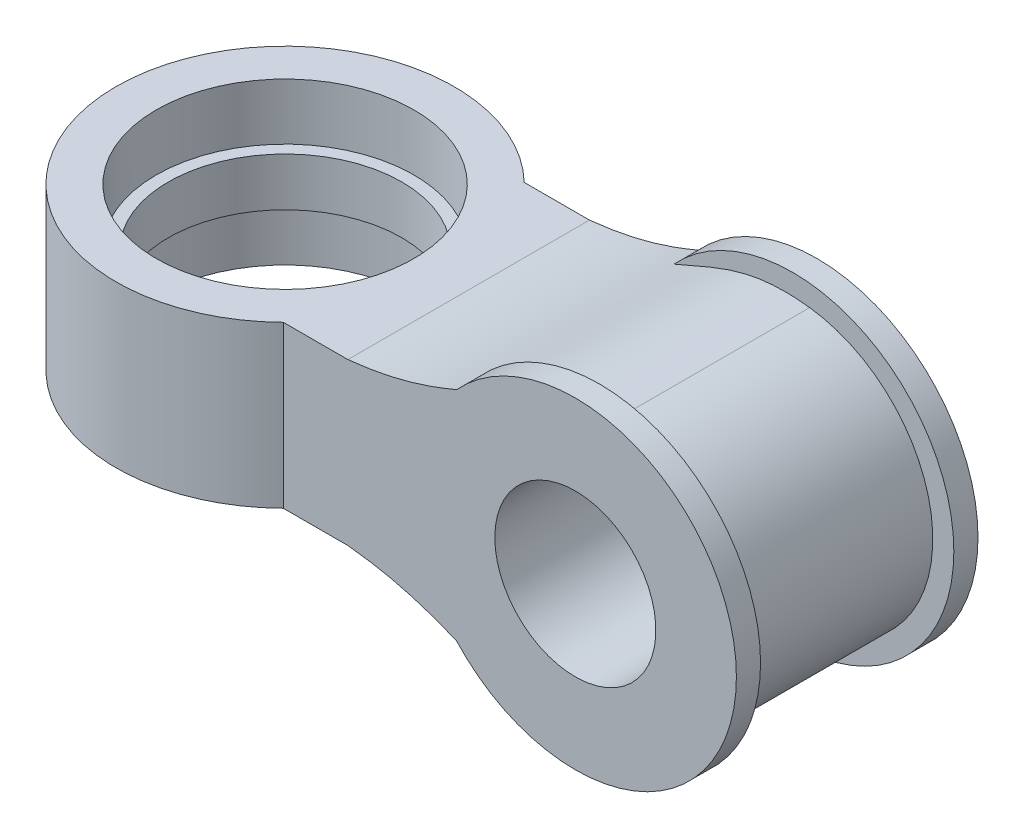
ISO-10303-21;
HEADER;
FILE_DESCRIPTION(('STEP AP214'),'2;1');
FILE_NAME('part.step','',(''),(''),'','','');
FILE_SCHEMA(('AUTOMOTIVE_DESIGN { 1 0 10303 214 1 1 1 1 }'));
ENDSEC;
DATA;
#1=APPLICATION_CONTEXT('core data for automotive mechanical design processes');
#2=APPLICATION_PROTOCOL_DEFINITION('international standard','automotive_design',2000,#1);
#3=PRODUCT_CONTEXT('',#1,'mechanical');
#4=PRODUCT('Part','Part','',(#3));
#5=PRODUCT_RELATED_PRODUCT_CATEGORY('part','',(#4));
#6=PRODUCT_DEFINITION_FORMATION('','',#4);
#7=PRODUCT_DEFINITION_CONTEXT('part definition',#1,'design');
#8=PRODUCT_DEFINITION('design','',#6,#7);
#9=PRODUCT_DEFINITION_SHAPE('','',#8);
#10=(LENGTH_UNIT() NAMED_UNIT(*) SI_UNIT(.MILLI.,.METRE.));
#11=(NAMED_UNIT(*) PLANE_ANGLE_UNIT() SI_UNIT($,.RADIAN.));
#12=(NAMED_UNIT(*) SI_UNIT($,.STERADIAN.) SOLID_ANGLE_UNIT());
#13=UNCERTAINTY_MEASURE_WITH_UNIT(LENGTH_MEASURE(1.E-05),#10,'distance_accuracy_value','');
#14=(GEOMETRIC_REPRESENTATION_CONTEXT(3) GLOBAL_UNCERTAINTY_ASSIGNED_CONTEXT((#13)) GLOBAL_UNIT_ASSIGNED_CONTEXT((#10,
#11,#12)) REPRESENTATION_CONTEXT('',''));
#15=CARTESIAN_POINT('',(0.,0.,0.));
#16=DIRECTION('',(0.,0.,1.));
#17=DIRECTION('',(1.,0.,0.));
#18=AXIS2_PLACEMENT_3D('',#15,#16,#17);
#19=CARTESIAN_POINT('',(-51.,-10.,15.0438784044279));
#20=DIRECTION('',(0.,1.,0.));
#21=DIRECTION('',(-1.,0.,0.));
#22=AXIS2_PLACEMENT_3D('',#19,#20,#21);
#23=CYLINDRICAL_SURFACE('',#22,16.);
#24=CARTESIAN_POINT('',(-51.,-10.,15.0438784044279));
#25=DIRECTION('',(0.,1.,0.));
#26=DIRECTION('',(-1.,0.,0.));
#27=AXIS2_PLACEMENT_3D('',#24,#25,#26);
#28=CIRCLE('',#27,16.);
#29=CARTESIAN_POINT('',(-67.,-10.,15.0438784044279));
#30=VERTEX_POINT('',#29);
#31=EDGE_CURVE('E227',#30,#30,#28,.T.);
#32=ORIENTED_EDGE('',*,*,#31,.F.);
#33=EDGE_LOOP('',(#32));
#34=FACE_BOUND('',#33,.T.);
#35=CARTESIAN_POINT('',(-51.,-3.,15.0438784044279));
#36=DIRECTION('',(0.,1.,0.));
#37=DIRECTION('',(0.,0.,1.));
#38=AXIS2_PLACEMENT_3D('',#35,#36,#37);
#39=CIRCLE('',#38,16.);
#40=CARTESIAN_POINT('',(-51.,-3.,31.0438784044279));
#41=VERTEX_POINT('',#40);
#42=EDGE_CURVE('E11',#41,#41,#39,.F.);
#43=ORIENTED_EDGE('',*,*,#42,.F.);
#44=EDGE_LOOP('',(#43));
#45=FACE_BOUND('',#44,.T.);
#46=ADVANCED_FACE('F41',(#34,#45),#23,.F.);
#47=CARTESIAN_POINT('',(0.,0.,30.));
#48=DIRECTION('',(0.,0.,-1.));
#49=DIRECTION('',(-1.,0.,0.));
#50=AXIS2_PLACEMENT_3D('',#47,#48,#49);
#51=CYLINDRICAL_SURFACE('',#50,17.3861277599397);
#52=DIRECTION('',(0.,0.,-1.));
#53=VECTOR('',#52,1.);
#54=CARTESIAN_POINT('',(2.10062296443295,17.2587607216231,30.));
#55=LINE('',#54,#53);
#56=CARTESIAN_POINT('',(2.10062296443295,17.2587607216231,27.));
#57=VERTEX_POINT('',#56);
#58=CARTESIAN_POINT('',(2.10062296443295,17.2587607216231,3.));
#59=VERTEX_POINT('',#58);
#60=EDGE_CURVE('E300',#57,#59,#55,.T.);
#61=ORIENTED_EDGE('',*,*,#60,.F.);
#62=CARTESIAN_POINT('',(0.,0.,27.));
#63=DIRECTION('',(0.,0.,1.));
#64=DIRECTION('',(1.,0.,0.));
#65=AXIS2_PLACEMENT_3D('',#62,#63,#64);
#66=CIRCLE('',#65,17.3861277599397);
#67=CARTESIAN_POINT('',(2.10062296443295,-17.2587607216231,27.));
#68=VERTEX_POINT('',#67);
#69=EDGE_CURVE('E336',#57,#68,#66,.F.);
#70=ORIENTED_EDGE('',*,*,#69,.T.);
#71=DIRECTION('',(0.,0.,-1.));
#72=VECTOR('',#71,1.);
#73=CARTESIAN_POINT('',(2.10062296443295,-17.2587607216231,30.));
#74=LINE('',#73,#72);
#75=CARTESIAN_POINT('',(2.10062296443295,-17.2587607216231,3.));
#76=VERTEX_POINT('',#75);
#77=EDGE_CURVE('E293',#68,#76,#74,.T.);
#78=ORIENTED_EDGE('',*,*,#77,.T.);
#79=CARTESIAN_POINT('',(0.,0.,3.));
#80=DIRECTION('',(0.,0.,1.));
#81=DIRECTION('',(1.,0.,0.));
#82=AXIS2_PLACEMENT_3D('',#79,#80,#81);
#83=CIRCLE('',#82,17.3861277599397);
#84=EDGE_CURVE('E317',#76,#59,#83,.T.);
#85=ORIENTED_EDGE('',*,*,#84,.T.);
#86=EDGE_LOOP('',(#61,#70,#78,#85));
#87=FACE_BOUND('',#86,.T.);
#88=ADVANCED_FACE('F174',(#87),#51,.T.);
#89=CARTESIAN_POINT('',(0.,0.,3.));
#90=DIRECTION('',(0.,0.,-1.));
#91=DIRECTION('',(-1.,0.,0.));
#92=AXIS2_PLACEMENT_3D('',#89,#90,#91);
#93=CYLINDRICAL_SURFACE('',#92,20.);
#94=DIRECTION('',(0.,0.,-1.));
#95=VECTOR('',#94,1.);
#96=CARTESIAN_POINT('',(-14.7412270743129,-13.5165167237548,30.));
#97=LINE('',#96,#95);
#98=CARTESIAN_POINT('',(-14.7412270743129,-13.5165167237548,0.));
#99=VERTEX_POINT('',#98);
#100=CARTESIAN_POINT('',(-14.7412270743129,-13.5165167237548,3.));
#101=VERTEX_POINT('',#100);
#102=EDGE_CURVE('E326',#99,#101,#97,.F.);
#103=ORIENTED_EDGE('',*,*,#102,.F.);
#104=CARTESIAN_POINT('',(0.,0.,0.));
#105=DIRECTION('',(0.,0.,1.));
#106=DIRECTION('',(1.,0.,0.));
#107=AXIS2_PLACEMENT_3D('',#104,#105,#106);
#108=CIRCLE('',#107,20.);
#109=CARTESIAN_POINT('',(-14.7412270743129,13.5165167237548,0.));
#110=VERTEX_POINT('',#109);
#111=EDGE_CURVE('E332',#99,#110,#108,.T.);
#112=ORIENTED_EDGE('',*,*,#111,.T.);
#113=DIRECTION('',(0.,0.,-1.));
#114=VECTOR('',#113,1.);
#115=CARTESIAN_POINT('',(-14.7412270743129,13.5165167237548,30.));
#116=LINE('',#115,#114);
#117=CARTESIAN_POINT('',(-14.7412270743129,13.5165167237548,3.));
#118=VERTEX_POINT('',#117);
#119=EDGE_CURVE('E310',#110,#118,#116,.F.);
#120=ORIENTED_EDGE('',*,*,#119,.T.);
#121=CARTESIAN_POINT('',(0.,0.,3.));
#122=DIRECTION('',(0.,0.,1.));
#123=DIRECTION('',(1.,0.,0.));
#124=AXIS2_PLACEMENT_3D('',#121,#122,#123);
#125=CIRCLE('',#124,20.);
#126=EDGE_CURVE('E333',#101,#118,#125,.T.);
#127=ORIENTED_EDGE('',*,*,#126,.F.);
#128=EDGE_LOOP('',(#103,#112,#120,#127));
#129=FACE_BOUND('',#128,.T.);
#130=ADVANCED_FACE('F43',(#129),#93,.T.);
#131=CARTESIAN_POINT('',(0.,0.,3.));
#132=DIRECTION('',(0.,0.,1.));
#133=DIRECTION('',(1.,0.,0.));
#134=AXIS2_PLACEMENT_3D('',#131,#132,#133);
#135=PLANE('',#134);
#136=ORIENTED_EDGE('',*,*,#84,.F.);
#137=CARTESIAN_POINT('',(-28.2444508318275,-10.,3.));
#138=CARTESIAN_POINT('',(-12.9902671690807,-11.5555353558737,3.));
#139=CARTESIAN_POINT('',(-9.90093372395772,-18.7195113511275,3.));
#140=CARTESIAN_POINT('',(2.10062296443295,-17.2587607216231,3.));
#141=B_SPLINE_CURVE_WITH_KNOTS('',3,(#137,#138,#139,#140),.UNSPECIFIED.,.F.,.F.,(4,4),(0.,1.),.UNSPECIFIED.);
#142=EDGE_CURVE('E321',#76,#101,#141,.F.);
#143=ORIENTED_EDGE('',*,*,#142,.T.);
#144=ORIENTED_EDGE('',*,*,#126,.T.);
#145=CARTESIAN_POINT('',(-28.2444508318275,10.,3.));
#146=CARTESIAN_POINT('',(-12.9902671690807,11.5555353558737,3.));
#147=CARTESIAN_POINT('',(-9.90093372395772,18.7195113511275,3.));
#148=CARTESIAN_POINT('',(2.10062296443295,17.2587607216231,3.));
#149=B_SPLINE_CURVE_WITH_KNOTS('',3,(#145,#146,#147,#148),.UNSPECIFIED.,.F.,.F.,(4,4),(0.,1.),.UNSPECIFIED.);
#150=EDGE_CURVE('E299',#59,#118,#149,.F.);
#151=ORIENTED_EDGE('',*,*,#150,.F.);
#152=EDGE_LOOP('',(#136,#143,#144,#151));
#153=FACE_BOUND('',#152,.T.);
#154=ADVANCED_FACE('F185',(#153),#135,.T.);
#155=CARTESIAN_POINT('',(0.,0.,0.));
#156=DIRECTION('',(0.,0.,1.));
#157=DIRECTION('',(1.,0.,0.));
#158=AXIS2_PLACEMENT_3D('',#155,#156,#157);
#159=PLANE('',#158);
#160=CARTESIAN_POINT('',(0.,0.,0.));
#161=DIRECTION('',(0.,0.,-1.));
#162=DIRECTION('',(-1.,0.,0.));
#163=AXIS2_PLACEMENT_3D('',#160,#161,#162);
#164=CIRCLE('',#163,10.);
#165=CARTESIAN_POINT('',(-10.,0.,0.));
#166=VERTEX_POINT('',#165);
#167=EDGE_CURVE('E245',#166,#166,#164,.T.);
#168=ORIENTED_EDGE('',*,*,#167,.F.);
#169=EDGE_LOOP('',(#168));
#170=FACE_BOUND('',#169,.T.);
#171=DIRECTION('',(-1.,0.,0.));
#172=VECTOR('',#171,1.);
#173=CARTESIAN_POINT('',(0.,-10.,0.));
#174=LINE('',#173,#172);
#175=CARTESIAN_POINT('',(-28.2444508318275,-10.,0.));
#176=VERTEX_POINT('',#175);
#177=CARTESIAN_POINT('',(-36.3479788918802,-10.,0.));
#178=VERTEX_POINT('',#177);
#179=EDGE_CURVE('E63',#176,#178,#174,.T.);
#180=ORIENTED_EDGE('',*,*,#179,.T.);
#181=DIRECTION('',(0.,1.,0.));
#182=VECTOR('',#181,1.);
#183=CARTESIAN_POINT('',(-36.3479788918802,-10.,0.));
#184=LINE('',#183,#182);
#185=CARTESIAN_POINT('',(-36.3479788918802,10.,0.));
#186=VERTEX_POINT('',#185);
#187=EDGE_CURVE('E58',#178,#186,#184,.T.);
#188=ORIENTED_EDGE('',*,*,#187,.T.);
#189=DIRECTION('',(-1.,0.,0.));
#190=VECTOR('',#189,1.);
#191=CARTESIAN_POINT('',(0.,10.,0.));
#192=LINE('',#191,#190);
#193=CARTESIAN_POINT('',(-28.2444508318275,10.,0.));
#194=VERTEX_POINT('',#193);
#195=EDGE_CURVE('E284',#194,#186,#192,.T.);
#196=ORIENTED_EDGE('',*,*,#195,.F.);
#197=CARTESIAN_POINT('',(-28.2444508318275,10.,0.));
#198=CARTESIAN_POINT('',(-12.9902671690807,11.5555353558737,0.));
#199=CARTESIAN_POINT('',(-9.90093372395772,18.7195113511275,0.));
#200=CARTESIAN_POINT('',(2.10062296443295,17.2587607216231,0.));
#201=B_SPLINE_CURVE_WITH_KNOTS('',3,(#197,#198,#199,#200),.UNSPECIFIED.,.F.,.F.,(4,4),(0.,1.),.UNSPECIFIED.);
#202=EDGE_CURVE('E141',#194,#110,#201,.T.);
#203=ORIENTED_EDGE('',*,*,#202,.T.);
#204=ORIENTED_EDGE('',*,*,#111,.F.);
#205=CARTESIAN_POINT('',(-28.2444508318275,-10.,0.));
#206=CARTESIAN_POINT('',(-12.9902671690807,-11.5555353558737,0.));
#207=CARTESIAN_POINT('',(-9.90093372395772,-18.7195113511275,0.));
#208=CARTESIAN_POINT('',(2.10062296443295,-17.2587607216231,0.));
#209=B_SPLINE_CURVE_WITH_KNOTS('',3,(#205,#206,#207,#208),.UNSPECIFIED.,.F.,.F.,(4,4),(0.,1.),.UNSPECIFIED.);
#210=EDGE_CURVE('E160',#176,#99,#209,.T.);
#211=ORIENTED_EDGE('',*,*,#210,.F.);
#212=EDGE_LOOP('',(#180,#188,#196,#203,#204,#211));
#213=FACE_BOUND('',#212,.T.);
#214=ADVANCED_FACE('F184',(#170,#213),#159,.F.);
#215=CARTESIAN_POINT('',(-28.2444508318275,-10.,30.));
#216=CARTESIAN_POINT('',(-12.9902671690807,-11.5555353558737,30.));
#217=CARTESIAN_POINT('',(-9.90093372395772,-18.7195113511275,30.));
#218=CARTESIAN_POINT('',(2.10062296443295,-17.2587607216231,30.));
#219=B_SPLINE_CURVE_WITH_KNOTS('',3,(#215,#216,#217,#218),.UNSPECIFIED.,.F.,.F.,(4,4),(0.,1.),.UNSPECIFIED.);
#220=DIRECTION('',(0.,0.,-1.));
#221=VECTOR('',#220,1.);
#222=SURFACE_OF_LINEAR_EXTRUSION('',#219,#221);
#223=CARTESIAN_POINT('',(-28.2444508318275,-10.,27.));
#224=CARTESIAN_POINT('',(-12.9902671690807,-11.5555353558737,27.));
#225=CARTESIAN_POINT('',(-9.90093372395772,-18.7195113511275,27.));
#226=CARTESIAN_POINT('',(2.10062296443295,-17.2587607216231,27.));
#227=B_SPLINE_CURVE_WITH_KNOTS('',3,(#223,#224,#225,#226),.UNSPECIFIED.,.F.,.F.,(4,4),(0.,1.),.UNSPECIFIED.);
#228=CARTESIAN_POINT('',(-14.7412270743129,-13.5165167237549,27.));
#229=VERTEX_POINT('',#228);
#230=EDGE_CURVE('E267',#229,#68,#227,.T.);
#231=ORIENTED_EDGE('',*,*,#230,.F.);
#232=DIRECTION('',(0.,0.,-1.));
#233=VECTOR('',#232,1.);
#234=CARTESIAN_POINT('',(-14.7412270743129,-13.5165167237549,30.));
#235=LINE('',#234,#233);
#236=CARTESIAN_POINT('',(-14.7412270743129,-13.5165167237549,30.));
#237=VERTEX_POINT('',#236);
#238=EDGE_CURVE('E136',#229,#237,#235,.F.);
#239=ORIENTED_EDGE('',*,*,#238,.T.);
#240=CARTESIAN_POINT('',(-28.2444508318275,-10.,30.));
#241=VERTEX_POINT('',#240);
#242=EDGE_CURVE('E133',#241,#237,#219,.T.);
#243=ORIENTED_EDGE('',*,*,#242,.F.);
#244=DIRECTION('',(0.,0.,-1.));
#245=VECTOR('',#244,1.);
#246=CARTESIAN_POINT('',(-28.2444508318275,-10.,30.));
#247=LINE('',#246,#245);
#248=EDGE_CURVE('E119',#241,#176,#247,.T.);
#249=ORIENTED_EDGE('',*,*,#248,.T.);
#250=ORIENTED_EDGE('',*,*,#210,.T.);
#251=ORIENTED_EDGE('',*,*,#102,.T.);
#252=ORIENTED_EDGE('',*,*,#142,.F.);
#253=ORIENTED_EDGE('',*,*,#77,.F.);
#254=EDGE_LOOP('',(#231,#239,#243,#249,#250,#251,#252,#253));
#255=FACE_BOUND('',#254,.T.);
#256=ADVANCED_FACE('F134',(#255),#222,.F.);
#257=CARTESIAN_POINT('',(-28.2444508318275,10.,30.));
#258=CARTESIAN_POINT('',(-12.9902671690807,11.5555353558737,30.));
#259=CARTESIAN_POINT('',(-9.90093372395772,18.7195113511275,30.));
#260=CARTESIAN_POINT('',(2.10062296443295,17.2587607216231,30.));
#261=B_SPLINE_CURVE_WITH_KNOTS('',3,(#257,#258,#259,#260),.UNSPECIFIED.,.F.,.F.,(4,4),(0.,1.),.UNSPECIFIED.);
#262=DIRECTION('',(0.,0.,-1.));
#263=VECTOR('',#262,1.);
#264=SURFACE_OF_LINEAR_EXTRUSION('',#261,#263);
#265=DIRECTION('',(0.,0.,-1.));
#266=VECTOR('',#265,1.);
#267=CARTESIAN_POINT('',(-14.7412270743129,13.5165167237549,30.));
#268=LINE('',#267,#266);
#269=CARTESIAN_POINT('',(-14.7412270743129,13.5165167237549,27.));
#270=VERTEX_POINT('',#269);
#271=CARTESIAN_POINT('',(-14.7412270743129,13.5165167237549,30.));
#272=VERTEX_POINT('',#271);
#273=EDGE_CURVE('E254',#270,#272,#268,.F.);
#274=ORIENTED_EDGE('',*,*,#273,.F.);
#275=CARTESIAN_POINT('',(-28.2444508318275,10.,27.));
#276=CARTESIAN_POINT('',(-12.9902671690807,11.5555353558737,27.));
#277=CARTESIAN_POINT('',(-9.90093372395772,18.7195113511275,27.));
#278=CARTESIAN_POINT('',(2.10062296443295,17.2587607216231,27.));
#279=B_SPLINE_CURVE_WITH_KNOTS('',3,(#275,#276,#277,#278),.UNSPECIFIED.,.F.,.F.,(4,4),(0.,1.),.UNSPECIFIED.);
#280=EDGE_CURVE('E263',#270,#57,#279,.T.);
#281=ORIENTED_EDGE('',*,*,#280,.T.);
#282=ORIENTED_EDGE('',*,*,#60,.T.);
#283=ORIENTED_EDGE('',*,*,#150,.T.);
#284=ORIENTED_EDGE('',*,*,#119,.F.);
#285=ORIENTED_EDGE('',*,*,#202,.F.);
#286=DIRECTION('',(0.,0.,-1.));
#287=VECTOR('',#286,1.);
#288=CARTESIAN_POINT('',(-28.2444508318275,10.,30.));
#289=LINE('',#288,#287);
#290=CARTESIAN_POINT('',(-28.2444508318275,10.,30.));
#291=VERTEX_POINT('',#290);
#292=EDGE_CURVE('E129',#291,#194,#289,.T.);
#293=ORIENTED_EDGE('',*,*,#292,.F.);
#294=EDGE_CURVE('E130',#291,#272,#261,.T.);
#295=ORIENTED_EDGE('',*,*,#294,.T.);
#296=EDGE_LOOP('',(#274,#281,#282,#283,#284,#285,#293,#295));
#297=FACE_BOUND('',#296,.T.);
#298=ADVANCED_FACE('F168',(#297),#264,.T.);
#299=CARTESIAN_POINT('',(0.,10.,30.));
#300=DIRECTION('',(0.,-1.,0.));
#301=DIRECTION('',(1.,0.,0.));
#302=AXIS2_PLACEMENT_3D('',#299,#300,#301);
#303=PLANE('',#302);
#304=ORIENTED_EDGE('',*,*,#195,.T.);
#305=CARTESIAN_POINT('',(-51.,10.,15.0438784044279));
#306=DIRECTION('',(0.,1.,0.));
#307=DIRECTION('',(-1.,0.,0.));
#308=AXIS2_PLACEMENT_3D('',#305,#306,#307);
#309=CIRCLE('',#308,21.);
#310=CARTESIAN_POINT('',(-36.2584116588998,10.,30.));
#311=VERTEX_POINT('',#310);
#312=EDGE_CURVE('E232',#186,#311,#309,.T.);
#313=ORIENTED_EDGE('',*,*,#312,.T.);
#314=DIRECTION('',(-1.,0.,0.));
#315=VECTOR('',#314,1.);
#316=CARTESIAN_POINT('',(0.,10.,30.));
#317=LINE('',#316,#315);
#318=EDGE_CURVE('E146',#291,#311,#317,.T.);
#319=ORIENTED_EDGE('',*,*,#318,.F.);
#320=ORIENTED_EDGE('',*,*,#292,.T.);
#321=EDGE_LOOP('',(#304,#313,#319,#320));
#322=FACE_BOUND('',#321,.T.);
#323=CARTESIAN_POINT('',(-51.,10.,15.0438784044279));
#324=DIRECTION('',(0.,1.,0.));
#325=DIRECTION('',(-1.,0.,0.));
#326=AXIS2_PLACEMENT_3D('',#323,#324,#325);
#327=CIRCLE('',#326,16.);
#328=CARTESIAN_POINT('',(-67.,9.99999999999999,15.0438784044279));
#329=VERTEX_POINT('',#328);
#330=EDGE_CURVE('E224',#329,#329,#327,.T.);
#331=ORIENTED_EDGE('',*,*,#330,.F.);
#332=EDGE_LOOP('',(#331));
#333=FACE_BOUND('',#332,.T.);
#334=ADVANCED_FACE('F172',(#322,#333),#303,.F.);
#335=CARTESIAN_POINT('',(0.,-10.,30.));
#336=DIRECTION('',(0.,-1.,0.));
#337=DIRECTION('',(1.,0.,0.));
#338=AXIS2_PLACEMENT_3D('',#335,#336,#337);
#339=PLANE('',#338);
#340=ORIENTED_EDGE('',*,*,#31,.T.);
#341=EDGE_LOOP('',(#340));
#342=FACE_BOUND('',#341,.T.);
#343=CARTESIAN_POINT('',(-51.,-10.,15.0438784044279));
#344=DIRECTION('',(0.,1.,0.));
#345=DIRECTION('',(-1.,0.,0.));
#346=AXIS2_PLACEMENT_3D('',#343,#344,#345);
#347=CIRCLE('',#346,21.);
#348=CARTESIAN_POINT('',(-36.2584116588998,-10.,30.));
#349=VERTEX_POINT('',#348);
#350=EDGE_CURVE('E237',#178,#349,#347,.T.);
#351=ORIENTED_EDGE('',*,*,#350,.F.);
#352=ORIENTED_EDGE('',*,*,#179,.F.);
#353=ORIENTED_EDGE('',*,*,#248,.F.);
#354=DIRECTION('',(-1.,0.,0.));
#355=VECTOR('',#354,1.);
#356=CARTESIAN_POINT('',(0.,-10.,30.));
#357=LINE('',#356,#355);
#358=EDGE_CURVE('E124',#241,#349,#357,.T.);
#359=ORIENTED_EDGE('',*,*,#358,.T.);
#360=EDGE_LOOP('',(#351,#352,#353,#359));
#361=FACE_BOUND('',#360,.T.);
#362=ADVANCED_FACE('F122',(#342,#361),#339,.T.);
#363=CARTESIAN_POINT('',(0.,0.,30.));
#364=DIRECTION('',(0.,0.,-1.));
#365=DIRECTION('',(-1.,0.,0.));
#366=AXIS2_PLACEMENT_3D('',#363,#364,#365);
#367=PLANE('',#366);
#368=CARTESIAN_POINT('',(0.,0.,30.));
#369=DIRECTION('',(0.,0.,-1.));
#370=DIRECTION('',(-1.,0.,0.));
#371=AXIS2_PLACEMENT_3D('',#368,#369,#370);
#372=CIRCLE('',#371,10.);
#373=CARTESIAN_POINT('',(-10.,0.,30.));
#374=VERTEX_POINT('',#373);
#375=EDGE_CURVE('E249',#374,#374,#372,.T.);
#376=ORIENTED_EDGE('',*,*,#375,.T.);
#377=EDGE_LOOP('',(#376));
#378=FACE_BOUND('',#377,.T.);
#379=ORIENTED_EDGE('',*,*,#318,.T.);
#380=DIRECTION('',(0.,1.,0.));
#381=VECTOR('',#380,1.);
#382=CARTESIAN_POINT('',(-36.2584116588998,-10.,30.));
#383=LINE('',#382,#381);
#384=EDGE_CURVE('E45',#311,#349,#383,.F.);
#385=ORIENTED_EDGE('',*,*,#384,.T.);
#386=ORIENTED_EDGE('',*,*,#358,.F.);
#387=ORIENTED_EDGE('',*,*,#242,.T.);
#388=CARTESIAN_POINT('',(0.,0.,30.));
#389=DIRECTION('',(0.,0.,1.));
#390=DIRECTION('',(1.,0.,0.));
#391=AXIS2_PLACEMENT_3D('',#388,#389,#390);
#392=CIRCLE('',#391,20.);
#393=EDGE_CURVE('E255',#237,#272,#392,.T.);
#394=ORIENTED_EDGE('',*,*,#393,.T.);
#395=ORIENTED_EDGE('',*,*,#294,.F.);
#396=EDGE_LOOP('',(#379,#385,#386,#387,#394,#395));
#397=FACE_BOUND('',#396,.T.);
#398=ADVANCED_FACE('F143',(#378,#397),#367,.F.);
#399=CARTESIAN_POINT('',(0.,0.,27.));
#400=DIRECTION('',(0.,0.,1.));
#401=DIRECTION('',(1.,0.,0.));
#402=AXIS2_PLACEMENT_3D('',#399,#400,#401);
#403=PLANE('',#402);
#404=CARTESIAN_POINT('',(0.,0.,27.));
#405=DIRECTION('',(0.,0.,1.));
#406=DIRECTION('',(1.,0.,0.));
#407=AXIS2_PLACEMENT_3D('',#404,#405,#406);
#408=CIRCLE('',#407,20.);
#409=EDGE_CURVE('E250',#229,#270,#408,.T.);
#410=ORIENTED_EDGE('',*,*,#409,.F.);
#411=ORIENTED_EDGE('',*,*,#230,.T.);
#412=ORIENTED_EDGE('',*,*,#69,.F.);
#413=ORIENTED_EDGE('',*,*,#280,.F.);
#414=EDGE_LOOP('',(#410,#411,#412,#413));
#415=FACE_BOUND('',#414,.T.);
#416=ADVANCED_FACE('F346',(#415),#403,.F.);
#417=CARTESIAN_POINT('',(0.,0.,27.));
#418=DIRECTION('',(0.,0.,1.));
#419=DIRECTION('',(1.,0.,0.));
#420=AXIS2_PLACEMENT_3D('',#417,#418,#419);
#421=CYLINDRICAL_SURFACE('',#420,20.);
#422=ORIENTED_EDGE('',*,*,#238,.F.);
#423=ORIENTED_EDGE('',*,*,#409,.T.);
#424=ORIENTED_EDGE('',*,*,#273,.T.);
#425=ORIENTED_EDGE('',*,*,#393,.F.);
#426=EDGE_LOOP('',(#422,#423,#424,#425));
#427=FACE_BOUND('',#426,.T.);
#428=ADVANCED_FACE('F215',(#427),#421,.T.);
#429=CARTESIAN_POINT('',(0.,0.,43.));
#430=DIRECTION('',(0.,0.,-1.));
#431=DIRECTION('',(-1.,0.,0.));
#432=AXIS2_PLACEMENT_3D('',#429,#430,#431);
#433=CYLINDRICAL_SURFACE('',#432,10.);
#434=ORIENTED_EDGE('',*,*,#167,.T.);
#435=EDGE_LOOP('',(#434));
#436=FACE_BOUND('',#435,.T.);
#437=ORIENTED_EDGE('',*,*,#375,.F.);
#438=EDGE_LOOP('',(#437));
#439=FACE_BOUND('',#438,.T.);
#440=ADVANCED_FACE('F207',(#436,#439),#433,.F.);
#441=CARTESIAN_POINT('',(-51.,3.,15.0438784044279));
#442=DIRECTION('',(0.,1.,0.));
#443=DIRECTION('',(0.,0.,1.));
#444=AXIS2_PLACEMENT_3D('',#441,#442,#443);
#445=CIRCLE('',#444,16.);
#446=CARTESIAN_POINT('',(-51.,3.,31.0438784044279));
#447=VERTEX_POINT('',#446);
#448=EDGE_CURVE('E221',#447,#447,#445,.F.);
#449=ORIENTED_EDGE('',*,*,#448,.T.);
#450=EDGE_LOOP('',(#449));
#451=FACE_BOUND('',#450,.T.);
#452=ORIENTED_EDGE('',*,*,#330,.T.);
#453=EDGE_LOOP('',(#452));
#454=FACE_BOUND('',#453,.T.);
#455=ADVANCED_FACE('F196',(#451,#454),#23,.F.);
#456=CARTESIAN_POINT('',(-51.,-10.,15.0438784044279));
#457=DIRECTION('',(0.,1.,0.));
#458=DIRECTION('',(-1.,0.,0.));
#459=AXIS2_PLACEMENT_3D('',#456,#457,#458);
#460=CYLINDRICAL_SURFACE('',#459,21.);
#461=ORIENTED_EDGE('',*,*,#312,.F.);
#462=ORIENTED_EDGE('',*,*,#187,.F.);
#463=ORIENTED_EDGE('',*,*,#350,.T.);
#464=ORIENTED_EDGE('',*,*,#384,.F.);
#465=EDGE_LOOP('',(#461,#462,#463,#464));
#466=FACE_BOUND('',#465,.T.);
#467=ADVANCED_FACE('F206',(#466),#460,.T.);
#468=CARTESIAN_POINT('',(-51.,-3.,15.0438784044279));
#469=DIRECTION('',(0.,1.,0.));
#470=DIRECTION('',(0.,0.,1.));
#471=AXIS2_PLACEMENT_3D('',#468,#469,#470);
#472=PLANE('',#471);
#473=CARTESIAN_POINT('',(-51.,-3.,15.0438784044279));
#474=DIRECTION('',(0.,1.,0.));
#475=DIRECTION('',(0.,0.,1.));
#476=AXIS2_PLACEMENT_3D('',#473,#474,#475);
#477=CIRCLE('',#476,14.5);
#478=CARTESIAN_POINT('',(-51.,-3.,29.5438784044279));
#479=VERTEX_POINT('',#478);
#480=EDGE_CURVE('E234',#479,#479,#477,.T.);
#481=ORIENTED_EDGE('',*,*,#480,.T.);
#482=EDGE_LOOP('',(#481));
#483=FACE_BOUND('',#482,.T.);
#484=ORIENTED_EDGE('',*,*,#42,.T.);
#485=EDGE_LOOP('',(#484));
#486=FACE_BOUND('',#485,.T.);
#487=ADVANCED_FACE('F213',(#483,#486),#472,.F.);
#488=CARTESIAN_POINT('',(-51.,3.,15.0438784044279));
#489=DIRECTION('',(0.,1.,0.));
#490=DIRECTION('',(0.,0.,1.));
#491=AXIS2_PLACEMENT_3D('',#488,#489,#490);
#492=PLANE('',#491);
#493=CARTESIAN_POINT('',(-51.,3.,15.0438784044279));
#494=DIRECTION('',(0.,1.,0.));
#495=DIRECTION('',(0.,0.,1.));
#496=AXIS2_PLACEMENT_3D('',#493,#494,#495);
#497=CIRCLE('',#496,14.5);
#498=CARTESIAN_POINT('',(-51.,3.,29.5438784044279));
#499=VERTEX_POINT('',#498);
#500=EDGE_CURVE('E490',#499,#499,#497,.T.);
#501=ORIENTED_EDGE('',*,*,#500,.F.);
#502=EDGE_LOOP('',(#501));
#503=FACE_BOUND('',#502,.T.);
#504=ORIENTED_EDGE('',*,*,#448,.F.);
#505=EDGE_LOOP('',(#504));
#506=FACE_BOUND('',#505,.T.);
#507=ADVANCED_FACE('F462',(#503,#506),#492,.T.);
#508=CARTESIAN_POINT('',(-51.,-3.,15.0438784044279));
#509=DIRECTION('',(0.,1.,0.));
#510=DIRECTION('',(0.,0.,1.));
#511=AXIS2_PLACEMENT_3D('',#508,#509,#510);
#512=CYLINDRICAL_SURFACE('',#511,14.5);
#513=ORIENTED_EDGE('',*,*,#480,.F.);
#514=EDGE_LOOP('',(#513));
#515=FACE_BOUND('',#514,.T.);
#516=ORIENTED_EDGE('',*,*,#500,.T.);
#517=EDGE_LOOP('',(#516));
#518=FACE_BOUND('',#517,.T.);
#519=ADVANCED_FACE('F471',(#515,#518),#512,.F.);
#520=CLOSED_SHELL('',(#46,#88,#130,#154,#214,#256,#298,#334,#362,#398,#416,#428,#440,#455,#467,
#487,#507,#519));
#521=MANIFOLD_SOLID_BREP('B2',#520);
#522=ADVANCED_BREP_SHAPE_REPRESENTATION('',(#18,#521),#14);
#523=SHAPE_DEFINITION_REPRESENTATION(#9,#522);
ENDSEC;
END-ISO-10303-21;
